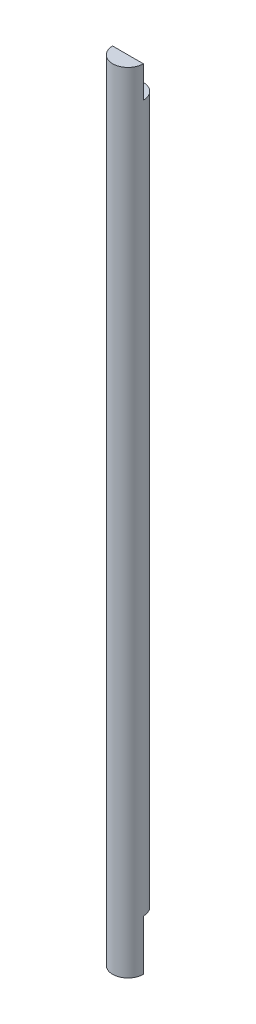
ISO-10303-21;
HEADER;
FILE_DESCRIPTION(('STEP AP214'),'2;1');
FILE_NAME('part.step','',(''),(''),'','','');
FILE_SCHEMA(('AUTOMOTIVE_DESIGN { 1 0 10303 214 1 1 1 1 }'));
ENDSEC;
DATA;
#1=APPLICATION_CONTEXT('core data for automotive mechanical design processes');
#2=APPLICATION_PROTOCOL_DEFINITION('international standard','automotive_design',2000,#1);
#3=PRODUCT_CONTEXT('',#1,'mechanical');
#4=PRODUCT('Part','Part','',(#3));
#5=PRODUCT_RELATED_PRODUCT_CATEGORY('part','',(#4));
#6=PRODUCT_DEFINITION_FORMATION('','',#4);
#7=PRODUCT_DEFINITION_CONTEXT('part definition',#1,'design');
#8=PRODUCT_DEFINITION('design','',#6,#7);
#9=PRODUCT_DEFINITION_SHAPE('','',#8);
#10=(LENGTH_UNIT() NAMED_UNIT(*) SI_UNIT(.MILLI.,.METRE.));
#11=(NAMED_UNIT(*) PLANE_ANGLE_UNIT() SI_UNIT($,.RADIAN.));
#12=(NAMED_UNIT(*) SI_UNIT($,.STERADIAN.) SOLID_ANGLE_UNIT());
#13=UNCERTAINTY_MEASURE_WITH_UNIT(LENGTH_MEASURE(1.E-05),#10,'distance_accuracy_value','');
#14=(GEOMETRIC_REPRESENTATION_CONTEXT(3) GLOBAL_UNCERTAINTY_ASSIGNED_CONTEXT((#13)) GLOBAL_UNIT_ASSIGNED_CONTEXT((#10,
#11,#12)) REPRESENTATION_CONTEXT('',''));
#15=CARTESIAN_POINT('',(0.,0.,0.));
#16=DIRECTION('',(0.,0.,1.));
#17=DIRECTION('',(1.,0.,0.));
#18=AXIS2_PLACEMENT_3D('',#15,#16,#17);
#19=CARTESIAN_POINT('',(0.,50.,0.));
#20=DIRECTION('',(0.,-1.,0.));
#21=DIRECTION('',(0.,0.,-1.));
#22=AXIS2_PLACEMENT_3D('',#19,#20,#21);
#23=CYLINDRICAL_SURFACE('',#22,1.95);
#24=DIRECTION('',(0.,-1.,0.));
#25=VECTOR('',#24,1.);
#26=CARTESIAN_POINT('',(-1.95,50.,0.));
#27=LINE('',#26,#25);
#28=CARTESIAN_POINT('',(-1.95,50.,0.));
#29=VERTEX_POINT('',#28);
#30=CARTESIAN_POINT('',(-1.95,46.,0.));
#31=VERTEX_POINT('',#30);
#32=EDGE_CURVE('E48',#29,#31,#27,.T.);
#33=ORIENTED_EDGE('',*,*,#32,.T.);
#34=CARTESIAN_POINT('',(0.,46.,0.));
#35=DIRECTION('',(0.,-1.,0.));
#36=DIRECTION('',(0.,0.,-1.));
#37=AXIS2_PLACEMENT_3D('',#34,#35,#36);
#38=CIRCLE('',#37,1.95);
#39=CARTESIAN_POINT('',(1.95000000000001,46.,0.));
#40=VERTEX_POINT('',#39);
#41=EDGE_CURVE('E11',#31,#40,#38,.T.);
#42=ORIENTED_EDGE('',*,*,#41,.T.);
#43=DIRECTION('',(0.,1.,0.));
#44=VECTOR('',#43,1.);
#45=CARTESIAN_POINT('',(1.95,50.,0.));
#46=LINE('',#45,#44);
#47=CARTESIAN_POINT('',(1.95,50.,0.));
#48=VERTEX_POINT('',#47);
#49=EDGE_CURVE('E80',#40,#48,#46,.T.);
#50=ORIENTED_EDGE('',*,*,#49,.T.);
#51=CARTESIAN_POINT('',(0.,50.,0.));
#52=DIRECTION('',(0.,1.,0.));
#53=DIRECTION('',(0.,0.,1.));
#54=AXIS2_PLACEMENT_3D('',#51,#52,#53);
#55=CIRCLE('',#54,1.95);
#56=EDGE_CURVE('E85',#29,#48,#55,.T.);
#57=ORIENTED_EDGE('',*,*,#56,.F.);
#58=EDGE_LOOP('',(#33,#42,#50,#57));
#59=FACE_BOUND('',#58,.T.);
#60=DIRECTION('',(0.,1.,0.));
#61=VECTOR('',#60,1.);
#62=CARTESIAN_POINT('',(1.95,-50.,0.));
#63=LINE('',#62,#61);
#64=CARTESIAN_POINT('',(1.95,-50.,0.));
#65=VERTEX_POINT('',#64);
#66=CARTESIAN_POINT('',(1.95,-43.6,0.));
#67=VERTEX_POINT('',#66);
#68=EDGE_CURVE('E56',#65,#67,#63,.T.);
#69=ORIENTED_EDGE('',*,*,#68,.T.);
#70=CARTESIAN_POINT('',(0.,-43.6,0.));
#71=DIRECTION('',(0.,1.,0.));
#72=DIRECTION('',(0.,0.,1.));
#73=AXIS2_PLACEMENT_3D('',#70,#71,#72);
#74=CIRCLE('',#73,1.95);
#75=CARTESIAN_POINT('',(-1.95,-43.6,0.));
#76=VERTEX_POINT('',#75);
#77=EDGE_CURVE('E41',#67,#76,#74,.T.);
#78=ORIENTED_EDGE('',*,*,#77,.T.);
#79=DIRECTION('',(0.,-1.,0.));
#80=VECTOR('',#79,1.);
#81=CARTESIAN_POINT('',(-1.95,-50.,0.));
#82=LINE('',#81,#80);
#83=CARTESIAN_POINT('',(-1.95,-50.,0.));
#84=VERTEX_POINT('',#83);
#85=EDGE_CURVE('E95',#76,#84,#82,.T.);
#86=ORIENTED_EDGE('',*,*,#85,.T.);
#87=CARTESIAN_POINT('',(0.,-50.,0.));
#88=DIRECTION('',(0.,1.,0.));
#89=DIRECTION('',(0.,0.,1.));
#90=AXIS2_PLACEMENT_3D('',#87,#88,#89);
#91=CIRCLE('',#90,1.95);
#92=EDGE_CURVE('E94',#84,#65,#91,.T.);
#93=ORIENTED_EDGE('',*,*,#92,.T.);
#94=EDGE_LOOP('',(#69,#78,#86,#93));
#95=FACE_BOUND('',#94,.T.);
#96=ADVANCED_FACE('F34',(#59,#95),#23,.T.);
#97=CARTESIAN_POINT('',(0.,-50.,0.));
#98=DIRECTION('',(0.,1.,0.));
#99=DIRECTION('',(0.,0.,1.));
#100=AXIS2_PLACEMENT_3D('',#97,#98,#99);
#101=PLANE('',#100);
#102=DIRECTION('',(1.,0.,0.));
#103=VECTOR('',#102,1.);
#104=CARTESIAN_POINT('',(-1.95,-50.,0.));
#105=LINE('',#104,#103);
#106=EDGE_CURVE('E98',#84,#65,#105,.T.);
#107=ORIENTED_EDGE('',*,*,#106,.T.);
#108=ORIENTED_EDGE('',*,*,#92,.F.);
#109=EDGE_LOOP('',(#107,#108));
#110=FACE_BOUND('',#109,.T.);
#111=ADVANCED_FACE('F109',(#110),#101,.F.);
#112=CARTESIAN_POINT('',(0.,50.,0.));
#113=DIRECTION('',(0.,1.,0.));
#114=DIRECTION('',(0.,0.,1.));
#115=AXIS2_PLACEMENT_3D('',#112,#113,#114);
#116=PLANE('',#115);
#117=DIRECTION('',(-1.,0.,0.));
#118=VECTOR('',#117,1.);
#119=CARTESIAN_POINT('',(-1.95,50.,0.));
#120=LINE('',#119,#118);
#121=EDGE_CURVE('E92',#48,#29,#120,.T.);
#122=ORIENTED_EDGE('',*,*,#121,.T.);
#123=ORIENTED_EDGE('',*,*,#56,.T.);
#124=EDGE_LOOP('',(#122,#123));
#125=FACE_BOUND('',#124,.T.);
#126=ADVANCED_FACE('F111',(#125),#116,.T.);
#127=CARTESIAN_POINT('',(-1.95,-43.6,-1.95));
#128=DIRECTION('',(0.,1.,0.));
#129=DIRECTION('',(0.,0.,1.));
#130=AXIS2_PLACEMENT_3D('',#127,#128,#129);
#131=PLANE('',#130);
#132=DIRECTION('',(-1.,0.,0.));
#133=VECTOR('',#132,1.);
#134=CARTESIAN_POINT('',(-1.95,-43.6,0.));
#135=LINE('',#134,#133);
#136=EDGE_CURVE('E86',#67,#76,#135,.T.);
#137=ORIENTED_EDGE('',*,*,#136,.T.);
#138=ORIENTED_EDGE('',*,*,#77,.F.);
#139=EDGE_LOOP('',(#137,#138));
#140=FACE_BOUND('',#139,.T.);
#141=ADVANCED_FACE('F106',(#140),#131,.F.);
#142=CARTESIAN_POINT('',(0.,0.,0.));
#143=DIRECTION('',(0.,0.,-1.));
#144=DIRECTION('',(-1.,0.,0.));
#145=AXIS2_PLACEMENT_3D('',#142,#143,#144);
#146=PLANE('',#145);
#147=ORIENTED_EDGE('',*,*,#85,.F.);
#148=ORIENTED_EDGE('',*,*,#136,.F.);
#149=ORIENTED_EDGE('',*,*,#68,.F.);
#150=ORIENTED_EDGE('',*,*,#106,.F.);
#151=EDGE_LOOP('',(#147,#148,#149,#150));
#152=FACE_BOUND('',#151,.T.);
#153=ADVANCED_FACE('F107',(#152),#146,.T.);
#154=CARTESIAN_POINT('',(-1.95,46.,-1.95));
#155=DIRECTION('',(0.,-1.,0.));
#156=DIRECTION('',(0.,0.,-1.));
#157=AXIS2_PLACEMENT_3D('',#154,#155,#156);
#158=PLANE('',#157);
#159=ORIENTED_EDGE('',*,*,#41,.F.);
#160=DIRECTION('',(1.,0.,0.));
#161=VECTOR('',#160,1.);
#162=CARTESIAN_POINT('',(-1.95,46.,0.));
#163=LINE('',#162,#161);
#164=EDGE_CURVE('E76',#31,#40,#163,.T.);
#165=ORIENTED_EDGE('',*,*,#164,.T.);
#166=EDGE_LOOP('',(#159,#165));
#167=FACE_BOUND('',#166,.T.);
#168=ADVANCED_FACE('F75',(#167),#158,.F.);
#169=CARTESIAN_POINT('',(0.,0.,0.));
#170=DIRECTION('',(0.,0.,1.));
#171=DIRECTION('',(1.,0.,0.));
#172=AXIS2_PLACEMENT_3D('',#169,#170,#171);
#173=PLANE('',#172);
#174=ORIENTED_EDGE('',*,*,#32,.F.);
#175=ORIENTED_EDGE('',*,*,#121,.F.);
#176=ORIENTED_EDGE('',*,*,#49,.F.);
#177=ORIENTED_EDGE('',*,*,#164,.F.);
#178=EDGE_LOOP('',(#174,#175,#176,#177));
#179=FACE_BOUND('',#178,.T.);
#180=ADVANCED_FACE('F79',(#179),#173,.F.);
#181=CLOSED_SHELL('',(#96,#111,#126,#141,#153,#168,#180));
#182=MANIFOLD_SOLID_BREP('B2',#181);
#183=ADVANCED_BREP_SHAPE_REPRESENTATION('',(#18,#182),#14);
#184=SHAPE_DEFINITION_REPRESENTATION(#9,#183);
ENDSEC;
END-ISO-10303-21;
